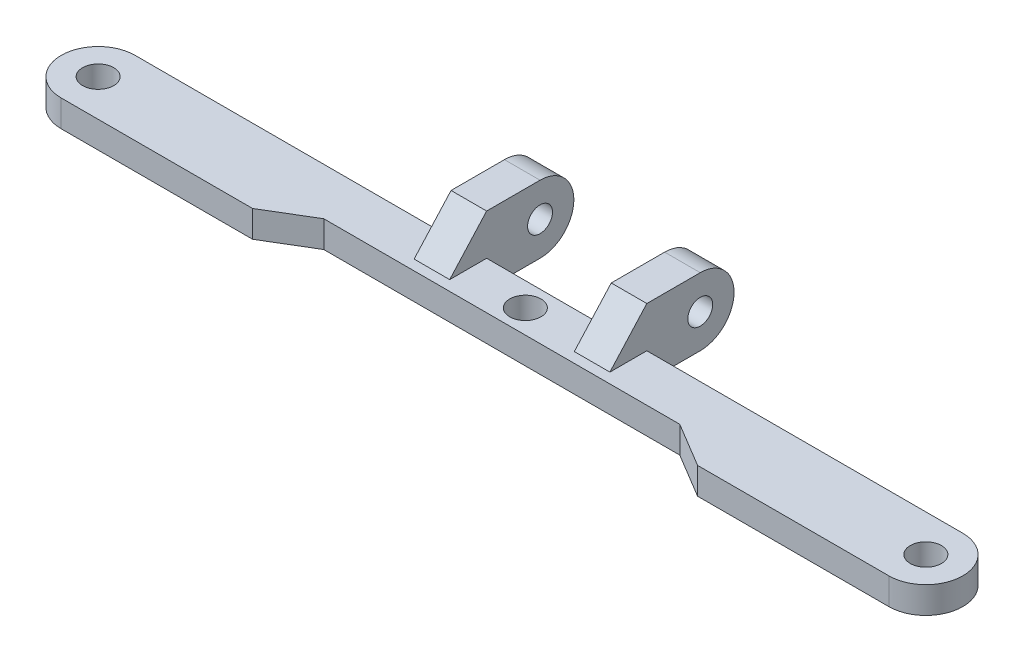
ISO-10303-21;
HEADER;
FILE_DESCRIPTION(('STEP AP214'),'2;1');
FILE_NAME('part.step','',(''),(''),'','','');
FILE_SCHEMA(('AUTOMOTIVE_DESIGN { 1 0 10303 214 1 1 1 1 }'));
ENDSEC;
DATA;
#1=APPLICATION_CONTEXT('core data for automotive mechanical design processes');
#2=APPLICATION_PROTOCOL_DEFINITION('international standard','automotive_design',2000,#1);
#3=PRODUCT_CONTEXT('',#1,'mechanical');
#4=PRODUCT('Part','Part','',(#3));
#5=PRODUCT_RELATED_PRODUCT_CATEGORY('part','',(#4));
#6=PRODUCT_DEFINITION_FORMATION('','',#4);
#7=PRODUCT_DEFINITION_CONTEXT('part definition',#1,'design');
#8=PRODUCT_DEFINITION('design','',#6,#7);
#9=PRODUCT_DEFINITION_SHAPE('','',#8);
#10=(LENGTH_UNIT() NAMED_UNIT(*) SI_UNIT(.MILLI.,.METRE.));
#11=(NAMED_UNIT(*) PLANE_ANGLE_UNIT() SI_UNIT($,.RADIAN.));
#12=(NAMED_UNIT(*) SI_UNIT($,.STERADIAN.) SOLID_ANGLE_UNIT());
#13=UNCERTAINTY_MEASURE_WITH_UNIT(LENGTH_MEASURE(1.E-05),#10,'distance_accuracy_value','');
#14=(GEOMETRIC_REPRESENTATION_CONTEXT(3) GLOBAL_UNCERTAINTY_ASSIGNED_CONTEXT((#13)) GLOBAL_UNIT_ASSIGNED_CONTEXT((#10,
#11,#12)) REPRESENTATION_CONTEXT('',''));
#15=CARTESIAN_POINT('',(0.,0.,0.));
#16=DIRECTION('',(0.,0.,1.));
#17=DIRECTION('',(1.,0.,0.));
#18=AXIS2_PLACEMENT_3D('',#15,#16,#17);
#19=CARTESIAN_POINT('',(-46.5,3.,4.14999999999999));
#20=DIRECTION('',(0.,0.,-1.));
#21=DIRECTION('',(-1.,0.,0.));
#22=AXIS2_PLACEMENT_3D('',#19,#20,#21);
#23=PLANE('',#22);
#24=DIRECTION('',(1.,0.,0.));
#25=VECTOR('',#24,1.);
#26=CARTESIAN_POINT('',(-46.5,0.,4.14999999999999));
#27=LINE('',#26,#25);
#28=CARTESIAN_POINT('',(-46.5,0.,4.14999999999999));
#29=VERTEX_POINT('',#28);
#30=CARTESIAN_POINT('',(-25.,0.,4.14999999999999));
#31=VERTEX_POINT('',#30);
#32=EDGE_CURVE('E322',#29,#31,#27,.T.);
#33=ORIENTED_EDGE('',*,*,#32,.T.);
#34=DIRECTION('',(0.,1.,0.));
#35=VECTOR('',#34,1.);
#36=CARTESIAN_POINT('',(-25.,0.,4.14999999999999));
#37=LINE('',#36,#35);
#38=CARTESIAN_POINT('',(-25.,3.,4.14999999999999));
#39=VERTEX_POINT('',#38);
#40=EDGE_CURVE('E206',#31,#39,#37,.T.);
#41=ORIENTED_EDGE('',*,*,#40,.T.);
#42=DIRECTION('',(1.,0.,0.));
#43=VECTOR('',#42,1.);
#44=CARTESIAN_POINT('',(-46.5,3.,4.14999999999999));
#45=LINE('',#44,#43);
#46=CARTESIAN_POINT('',(-46.5,3.,4.14999999999999));
#47=VERTEX_POINT('',#46);
#48=EDGE_CURVE('E330',#47,#39,#45,.T.);
#49=ORIENTED_EDGE('',*,*,#48,.F.);
#50=DIRECTION('',(0.,-1.,0.));
#51=VECTOR('',#50,1.);
#52=CARTESIAN_POINT('',(-46.5,3.,4.14999999999999));
#53=LINE('',#52,#51);
#54=EDGE_CURVE('E347',#47,#29,#53,.T.);
#55=ORIENTED_EDGE('',*,*,#54,.T.);
#56=EDGE_LOOP('',(#33,#41,#49,#55));
#57=FACE_BOUND('',#56,.T.);
#58=ADVANCED_FACE('F35',(#57),#23,.F.);
#59=CARTESIAN_POINT('',(46.5,3.,0.));
#60=DIRECTION('',(0.,1.,0.));
#61=DIRECTION('',(0.,0.,1.));
#62=AXIS2_PLACEMENT_3D('',#59,#60,#61);
#63=PLANE('',#62);
#64=CARTESIAN_POINT('',(0.,3.,-1.5));
#65=DIRECTION('',(0.,1.,0.));
#66=DIRECTION('',(0.,0.,1.));
#67=AXIS2_PLACEMENT_3D('',#64,#65,#66);
#68=CIRCLE('',#67,1.75);
#69=CARTESIAN_POINT('',(0.,3.,0.250000000000001));
#70=VERTEX_POINT('',#69);
#71=EDGE_CURVE('E199',#70,#70,#68,.T.);
#72=ORIENTED_EDGE('',*,*,#71,.F.);
#73=EDGE_LOOP('',(#72));
#74=FACE_BOUND('',#73,.T.);
#75=DIRECTION('',(-0.857492925712544,0.,0.514495755427526));
#76=VECTOR('',#75,1.);
#77=CARTESIAN_POINT('',(-25.,3.,4.14999999999999));
#78=LINE('',#77,#76);
#79=CARTESIAN_POINT('',(-20.,3.,1.14999999999999));
#80=VERTEX_POINT('',#79);
#81=EDGE_CURVE('E194',#80,#39,#78,.T.);
#82=ORIENTED_EDGE('',*,*,#81,.F.);
#83=DIRECTION('',(-1.,0.,0.));
#84=VECTOR('',#83,1.);
#85=CARTESIAN_POINT('',(-20.,3.,1.14999999999999));
#86=LINE('',#85,#84);
#87=CARTESIAN_POINT('',(20.,3.,1.14999999999999));
#88=VERTEX_POINT('',#87);
#89=EDGE_CURVE('E196',#88,#80,#86,.T.);
#90=ORIENTED_EDGE('',*,*,#89,.F.);
#91=DIRECTION('',(-0.857492925712545,0.,-0.514495755427526));
#92=VECTOR('',#91,1.);
#93=CARTESIAN_POINT('',(20.,3.,1.14999999999999));
#94=LINE('',#93,#92);
#95=CARTESIAN_POINT('',(25.,3.,4.14999999999998));
#96=VERTEX_POINT('',#95);
#97=EDGE_CURVE('E174',#96,#88,#94,.T.);
#98=ORIENTED_EDGE('',*,*,#97,.F.);
#99=CARTESIAN_POINT('',(46.5,3.,4.14999999999998));
#100=VERTEX_POINT('',#99);
#101=EDGE_CURVE('E329',#96,#100,#45,.T.);
#102=ORIENTED_EDGE('',*,*,#101,.T.);
#103=CARTESIAN_POINT('',(46.5,3.,0.));
#104=DIRECTION('',(0.,1.,0.));
#105=DIRECTION('',(0.,0.,1.));
#106=AXIS2_PLACEMENT_3D('',#103,#104,#105);
#107=CIRCLE('',#106,4.14999999999999);
#108=CARTESIAN_POINT('',(46.5,3.,-4.15));
#109=VERTEX_POINT('',#108);
#110=EDGE_CURVE('E318',#100,#109,#107,.T.);
#111=ORIENTED_EDGE('',*,*,#110,.T.);
#112=DIRECTION('',(-1.,0.,0.));
#113=VECTOR('',#112,1.);
#114=CARTESIAN_POINT('',(-46.5,3.,-4.14999999999999));
#115=LINE('',#114,#113);
#116=CARTESIAN_POINT('',(11.,3.,-4.15));
#117=VERTEX_POINT('',#116);
#118=EDGE_CURVE('E323',#109,#117,#115,.T.);
#119=ORIENTED_EDGE('',*,*,#118,.T.);
#120=DIRECTION('',(0.,0.,-1.));
#121=VECTOR('',#120,1.);
#122=CARTESIAN_POINT('',(11.,3.,0.));
#123=LINE('',#122,#121);
#124=CARTESIAN_POINT('',(11.,3.,0.));
#125=VERTEX_POINT('',#124);
#126=EDGE_CURVE('E292',#125,#117,#123,.T.);
#127=ORIENTED_EDGE('',*,*,#126,.F.);
#128=DIRECTION('',(1.,0.,0.));
#129=VECTOR('',#128,1.);
#130=CARTESIAN_POINT('',(7.,3.,0.));
#131=LINE('',#130,#129);
#132=CARTESIAN_POINT('',(7.,3.,0.));
#133=VERTEX_POINT('',#132);
#134=EDGE_CURVE('E301',#133,#125,#131,.T.);
#135=ORIENTED_EDGE('',*,*,#134,.F.);
#136=DIRECTION('',(0.,0.,-1.));
#137=VECTOR('',#136,1.);
#138=CARTESIAN_POINT('',(7.,3.,0.));
#139=LINE('',#138,#137);
#140=CARTESIAN_POINT('',(7.,3.,-4.15));
#141=VERTEX_POINT('',#140);
#142=EDGE_CURVE('E274',#133,#141,#139,.T.);
#143=ORIENTED_EDGE('',*,*,#142,.T.);
#144=CARTESIAN_POINT('',(-7.00000000000001,3.,-4.14999999999999));
#145=VERTEX_POINT('',#144);
#146=EDGE_CURVE('E327',#141,#145,#115,.T.);
#147=ORIENTED_EDGE('',*,*,#146,.T.);
#148=DIRECTION('',(0.,0.,-1.));
#149=VECTOR('',#148,1.);
#150=CARTESIAN_POINT('',(-7.,3.,0.));
#151=LINE('',#150,#149);
#152=CARTESIAN_POINT('',(-7.,3.,0.));
#153=VERTEX_POINT('',#152);
#154=EDGE_CURVE('E227',#153,#145,#151,.T.);
#155=ORIENTED_EDGE('',*,*,#154,.F.);
#156=DIRECTION('',(-1.,0.,0.));
#157=VECTOR('',#156,1.);
#158=CARTESIAN_POINT('',(-7.,3.,0.));
#159=LINE('',#158,#157);
#160=CARTESIAN_POINT('',(-11.,3.,0.));
#161=VERTEX_POINT('',#160);
#162=EDGE_CURVE('E58',#153,#161,#159,.T.);
#163=ORIENTED_EDGE('',*,*,#162,.T.);
#164=DIRECTION('',(0.,0.,-1.));
#165=VECTOR('',#164,1.);
#166=CARTESIAN_POINT('',(-11.,3.,0.));
#167=LINE('',#166,#165);
#168=CARTESIAN_POINT('',(-11.,3.,-4.14999999999999));
#169=VERTEX_POINT('',#168);
#170=EDGE_CURVE('E243',#161,#169,#167,.T.);
#171=ORIENTED_EDGE('',*,*,#170,.T.);
#172=CARTESIAN_POINT('',(-46.5,3.,-4.14999999999999));
#173=VERTEX_POINT('',#172);
#174=EDGE_CURVE('E321',#169,#173,#115,.T.);
#175=ORIENTED_EDGE('',*,*,#174,.T.);
#176=CARTESIAN_POINT('',(-46.5,3.,0.));
#177=DIRECTION('',(0.,1.,0.));
#178=DIRECTION('',(0.,0.,1.));
#179=AXIS2_PLACEMENT_3D('',#176,#177,#178);
#180=CIRCLE('',#179,4.14999999999999);
#181=EDGE_CURVE('E326',#173,#47,#180,.T.);
#182=ORIENTED_EDGE('',*,*,#181,.T.);
#183=ORIENTED_EDGE('',*,*,#48,.T.);
#184=EDGE_LOOP('',(#82,#90,#98,#102,#111,#119,#127,#135,#143,#147,#155,#163,#171,#175,#182,#183));
#185=FACE_BOUND('',#184,.T.);
#186=CARTESIAN_POINT('',(-46.5,3.,0.));
#187=DIRECTION('',(0.,1.,0.));
#188=DIRECTION('',(0.,0.,1.));
#189=AXIS2_PLACEMENT_3D('',#186,#187,#188);
#190=CIRCLE('',#189,1.75);
#191=CARTESIAN_POINT('',(-46.5,3.,1.75));
#192=VERTEX_POINT('',#191);
#193=EDGE_CURVE('E312',#192,#192,#190,.T.);
#194=ORIENTED_EDGE('',*,*,#193,.F.);
#195=EDGE_LOOP('',(#194));
#196=FACE_BOUND('',#195,.T.);
#197=CARTESIAN_POINT('',(46.5,3.,0.));
#198=DIRECTION('',(0.,1.,0.));
#199=DIRECTION('',(0.,0.,1.));
#200=AXIS2_PLACEMENT_3D('',#197,#198,#199);
#201=CIRCLE('',#200,1.75);
#202=CARTESIAN_POINT('',(46.5,3.,1.74999999999999));
#203=VERTEX_POINT('',#202);
#204=EDGE_CURVE('E306',#203,#203,#201,.T.);
#205=ORIENTED_EDGE('',*,*,#204,.F.);
#206=EDGE_LOOP('',(#205));
#207=FACE_BOUND('',#206,.T.);
#208=ADVANCED_FACE('F362',(#74,#185,#196,#207),#63,.T.);
#209=CARTESIAN_POINT('',(-46.5,3.,-4.14999999999999));
#210=DIRECTION('',(0.,0.,1.));
#211=DIRECTION('',(1.,0.,0.));
#212=AXIS2_PLACEMENT_3D('',#209,#210,#211);
#213=PLANE('',#212);
#214=DIRECTION('',(0.,-1.,0.));
#215=VECTOR('',#214,1.);
#216=CARTESIAN_POINT('',(-7.,3.,-4.15));
#217=LINE('',#216,#215);
#218=CARTESIAN_POINT('',(-7.00000000000001,0.,-4.14999999999999));
#219=VERTEX_POINT('',#218);
#220=EDGE_CURVE('E224',#145,#219,#217,.T.);
#221=ORIENTED_EDGE('',*,*,#220,.F.);
#222=ORIENTED_EDGE('',*,*,#146,.F.);
#223=DIRECTION('',(0.,-1.,0.));
#224=VECTOR('',#223,1.);
#225=CARTESIAN_POINT('',(7.,3.,-4.15));
#226=LINE('',#225,#224);
#227=CARTESIAN_POINT('',(7.,0.,-4.15));
#228=VERTEX_POINT('',#227);
#229=EDGE_CURVE('E277',#141,#228,#226,.T.);
#230=ORIENTED_EDGE('',*,*,#229,.T.);
#231=DIRECTION('',(-1.,0.,0.));
#232=VECTOR('',#231,1.);
#233=CARTESIAN_POINT('',(-46.5,0.,-4.14999999999999));
#234=LINE('',#233,#232);
#235=EDGE_CURVE('E341',#228,#219,#234,.T.);
#236=ORIENTED_EDGE('',*,*,#235,.T.);
#237=EDGE_LOOP('',(#221,#222,#230,#236));
#238=FACE_BOUND('',#237,.T.);
#239=ADVANCED_FACE('F386',(#238),#213,.F.);
#240=ORIENTED_EDGE('',*,*,#174,.F.);
#241=DIRECTION('',(0.,-1.,0.));
#242=VECTOR('',#241,1.);
#243=CARTESIAN_POINT('',(-11.,3.,-4.15));
#244=LINE('',#243,#242);
#245=CARTESIAN_POINT('',(-11.,0.,-4.15));
#246=VERTEX_POINT('',#245);
#247=EDGE_CURVE('E240',#169,#246,#244,.T.);
#248=ORIENTED_EDGE('',*,*,#247,.T.);
#249=CARTESIAN_POINT('',(-46.5,0.,-4.14999999999999));
#250=VERTEX_POINT('',#249);
#251=EDGE_CURVE('E336',#246,#250,#234,.T.);
#252=ORIENTED_EDGE('',*,*,#251,.T.);
#253=DIRECTION('',(0.,-1.,0.));
#254=VECTOR('',#253,1.);
#255=CARTESIAN_POINT('',(-46.5,3.,-4.14999999999999));
#256=LINE('',#255,#254);
#257=EDGE_CURVE('E43',#173,#250,#256,.T.);
#258=ORIENTED_EDGE('',*,*,#257,.F.);
#259=EDGE_LOOP('',(#240,#248,#252,#258));
#260=FACE_BOUND('',#259,.T.);
#261=ADVANCED_FACE('F384',(#260),#213,.F.);
#262=CARTESIAN_POINT('',(46.5,0.,0.));
#263=DIRECTION('',(0.,1.,0.));
#264=DIRECTION('',(0.,0.,1.));
#265=AXIS2_PLACEMENT_3D('',#262,#263,#264);
#266=PLANE('',#265);
#267=CARTESIAN_POINT('',(0.,0.,-1.5));
#268=DIRECTION('',(0.,1.,0.));
#269=DIRECTION('',(0.,0.,1.));
#270=AXIS2_PLACEMENT_3D('',#267,#268,#269);
#271=CIRCLE('',#270,1.75);
#272=CARTESIAN_POINT('',(0.,0.,0.250000000000001));
#273=VERTEX_POINT('',#272);
#274=EDGE_CURVE('E204',#273,#273,#271,.T.);
#275=ORIENTED_EDGE('',*,*,#274,.T.);
#276=EDGE_LOOP('',(#275));
#277=FACE_BOUND('',#276,.T.);
#278=DIRECTION('',(-1.,0.,0.));
#279=VECTOR('',#278,1.);
#280=CARTESIAN_POINT('',(-20.,0.,1.14999999999999));
#281=LINE('',#280,#279);
#282=CARTESIAN_POINT('',(20.,0.,1.14999999999999));
#283=VERTEX_POINT('',#282);
#284=CARTESIAN_POINT('',(-20.,0.,1.14999999999999));
#285=VERTEX_POINT('',#284);
#286=EDGE_CURVE('E182',#283,#285,#281,.T.);
#287=ORIENTED_EDGE('',*,*,#286,.T.);
#288=DIRECTION('',(-0.857492925712544,0.,0.514495755427526));
#289=VECTOR('',#288,1.);
#290=CARTESIAN_POINT('',(-25.,0.,4.14999999999999));
#291=LINE('',#290,#289);
#292=EDGE_CURVE('E187',#285,#31,#291,.T.);
#293=ORIENTED_EDGE('',*,*,#292,.T.);
#294=ORIENTED_EDGE('',*,*,#32,.F.);
#295=CARTESIAN_POINT('',(-46.5,0.,0.));
#296=DIRECTION('',(0.,1.,0.));
#297=DIRECTION('',(0.,0.,1.));
#298=AXIS2_PLACEMENT_3D('',#295,#296,#297);
#299=CIRCLE('',#298,4.14999999999999);
#300=EDGE_CURVE('E340',#250,#29,#299,.T.);
#301=ORIENTED_EDGE('',*,*,#300,.F.);
#302=ORIENTED_EDGE('',*,*,#251,.F.);
#303=DIRECTION('',(0.,0.,-1.));
#304=VECTOR('',#303,1.);
#305=CARTESIAN_POINT('',(-11.,0.,-4.15));
#306=LINE('',#305,#304);
#307=CARTESIAN_POINT('',(-11.,0.,-10.15));
#308=VERTEX_POINT('',#307);
#309=EDGE_CURVE('E238',#246,#308,#306,.T.);
#310=ORIENTED_EDGE('',*,*,#309,.T.);
#311=DIRECTION('',(-1.,0.,0.));
#312=VECTOR('',#311,1.);
#313=CARTESIAN_POINT('',(-7.,0.,-10.15));
#314=LINE('',#313,#312);
#315=CARTESIAN_POINT('',(-7.,0.,-10.15));
#316=VERTEX_POINT('',#315);
#317=EDGE_CURVE('E235',#316,#308,#314,.T.);
#318=ORIENTED_EDGE('',*,*,#317,.F.);
#319=DIRECTION('',(0.,0.,-1.));
#320=VECTOR('',#319,1.);
#321=CARTESIAN_POINT('',(-7.,0.,-4.15));
#322=LINE('',#321,#320);
#323=EDGE_CURVE('E221',#219,#316,#322,.T.);
#324=ORIENTED_EDGE('',*,*,#323,.F.);
#325=ORIENTED_EDGE('',*,*,#235,.F.);
#326=DIRECTION('',(0.,0.,-1.));
#327=VECTOR('',#326,1.);
#328=CARTESIAN_POINT('',(7.,0.,-4.15));
#329=LINE('',#328,#327);
#330=CARTESIAN_POINT('',(7.,0.,-10.15));
#331=VERTEX_POINT('',#330);
#332=EDGE_CURVE('E280',#228,#331,#329,.T.);
#333=ORIENTED_EDGE('',*,*,#332,.T.);
#334=DIRECTION('',(1.,0.,0.));
#335=VECTOR('',#334,1.);
#336=CARTESIAN_POINT('',(7.,0.,-10.15));
#337=LINE('',#336,#335);
#338=CARTESIAN_POINT('',(11.,0.,-10.15));
#339=VERTEX_POINT('',#338);
#340=EDGE_CURVE('E298',#331,#339,#337,.T.);
#341=ORIENTED_EDGE('',*,*,#340,.T.);
#342=DIRECTION('',(0.,0.,-1.));
#343=VECTOR('',#342,1.);
#344=CARTESIAN_POINT('',(11.,0.,-4.15));
#345=LINE('',#344,#343);
#346=CARTESIAN_POINT('',(11.,0.,-4.15));
#347=VERTEX_POINT('',#346);
#348=EDGE_CURVE('E268',#347,#339,#345,.T.);
#349=ORIENTED_EDGE('',*,*,#348,.F.);
#350=CARTESIAN_POINT('',(46.5,0.,-4.15));
#351=VERTEX_POINT('',#350);
#352=EDGE_CURVE('E337',#351,#347,#234,.T.);
#353=ORIENTED_EDGE('',*,*,#352,.F.);
#354=CARTESIAN_POINT('',(46.5,0.,0.));
#355=DIRECTION('',(0.,1.,0.));
#356=DIRECTION('',(0.,0.,1.));
#357=AXIS2_PLACEMENT_3D('',#354,#355,#356);
#358=CIRCLE('',#357,4.14999999999999);
#359=CARTESIAN_POINT('',(46.5,0.,4.14999999999998));
#360=VERTEX_POINT('',#359);
#361=EDGE_CURVE('E315',#360,#351,#358,.T.);
#362=ORIENTED_EDGE('',*,*,#361,.F.);
#363=CARTESIAN_POINT('',(25.,0.,4.14999999999998));
#364=VERTEX_POINT('',#363);
#365=EDGE_CURVE('E193',#364,#360,#27,.T.);
#366=ORIENTED_EDGE('',*,*,#365,.F.);
#367=DIRECTION('',(-0.857492925712545,0.,-0.514495755427526));
#368=VECTOR('',#367,1.);
#369=CARTESIAN_POINT('',(20.,0.,1.14999999999999));
#370=LINE('',#369,#368);
#371=EDGE_CURVE('E50',#364,#283,#370,.T.);
#372=ORIENTED_EDGE('',*,*,#371,.T.);
#373=EDGE_LOOP('',(#287,#293,#294,#301,#302,#310,#318,#324,#325,#333,#341,#349,#353,#362,#366,#372));
#374=FACE_BOUND('',#373,.T.);
#375=CARTESIAN_POINT('',(-46.5,0.,0.));
#376=DIRECTION('',(0.,1.,0.));
#377=DIRECTION('',(0.,0.,1.));
#378=AXIS2_PLACEMENT_3D('',#375,#376,#377);
#379=CIRCLE('',#378,1.75);
#380=CARTESIAN_POINT('',(-46.5,0.,1.75));
#381=VERTEX_POINT('',#380);
#382=EDGE_CURVE('E309',#381,#381,#379,.T.);
#383=ORIENTED_EDGE('',*,*,#382,.T.);
#384=EDGE_LOOP('',(#383));
#385=FACE_BOUND('',#384,.T.);
#386=CARTESIAN_POINT('',(46.5,0.,0.));
#387=DIRECTION('',(0.,1.,0.));
#388=DIRECTION('',(0.,0.,1.));
#389=AXIS2_PLACEMENT_3D('',#386,#387,#388);
#390=CIRCLE('',#389,1.75);
#391=CARTESIAN_POINT('',(46.5,0.,1.74999999999999));
#392=VERTEX_POINT('',#391);
#393=EDGE_CURVE('E300',#392,#392,#390,.T.);
#394=ORIENTED_EDGE('',*,*,#393,.T.);
#395=EDGE_LOOP('',(#394));
#396=FACE_BOUND('',#395,.T.);
#397=ADVANCED_FACE('F190',(#277,#374,#385,#396),#266,.F.);
#398=CARTESIAN_POINT('',(46.5,3.,0.));
#399=DIRECTION('',(0.,-1.,0.));
#400=DIRECTION('',(0.,0.,-1.));
#401=AXIS2_PLACEMENT_3D('',#398,#399,#400);
#402=CYLINDRICAL_SURFACE('',#401,4.14999999999999);
#403=ORIENTED_EDGE('',*,*,#361,.T.);
#404=DIRECTION('',(0.,-1.,0.));
#405=VECTOR('',#404,1.);
#406=CARTESIAN_POINT('',(46.5,3.,-4.15));
#407=LINE('',#406,#405);
#408=EDGE_CURVE('E11',#109,#351,#407,.T.);
#409=ORIENTED_EDGE('',*,*,#408,.F.);
#410=ORIENTED_EDGE('',*,*,#110,.F.);
#411=DIRECTION('',(0.,-1.,0.));
#412=VECTOR('',#411,1.);
#413=CARTESIAN_POINT('',(46.5,3.,4.14999999999998));
#414=LINE('',#413,#412);
#415=EDGE_CURVE('E333',#100,#360,#414,.T.);
#416=ORIENTED_EDGE('',*,*,#415,.T.);
#417=EDGE_LOOP('',(#403,#409,#410,#416));
#418=FACE_BOUND('',#417,.T.);
#419=ADVANCED_FACE('F37',(#418),#402,.T.);
#420=ORIENTED_EDGE('',*,*,#352,.T.);
#421=DIRECTION('',(0.,-1.,0.));
#422=VECTOR('',#421,1.);
#423=CARTESIAN_POINT('',(11.,3.,-4.15));
#424=LINE('',#423,#422);
#425=EDGE_CURVE('E294',#117,#347,#424,.T.);
#426=ORIENTED_EDGE('',*,*,#425,.F.);
#427=ORIENTED_EDGE('',*,*,#118,.F.);
#428=ORIENTED_EDGE('',*,*,#408,.T.);
#429=EDGE_LOOP('',(#420,#426,#427,#428));
#430=FACE_BOUND('',#429,.T.);
#431=ADVANCED_FACE('F424',(#430),#213,.F.);
#432=CARTESIAN_POINT('',(-46.5,3.,0.));
#433=DIRECTION('',(0.,-1.,0.));
#434=DIRECTION('',(0.,0.,-1.));
#435=AXIS2_PLACEMENT_3D('',#432,#433,#434);
#436=CYLINDRICAL_SURFACE('',#435,4.14999999999999);
#437=ORIENTED_EDGE('',*,*,#300,.T.);
#438=ORIENTED_EDGE('',*,*,#54,.F.);
#439=ORIENTED_EDGE('',*,*,#181,.F.);
#440=ORIENTED_EDGE('',*,*,#257,.T.);
#441=EDGE_LOOP('',(#437,#438,#439,#440));
#442=FACE_BOUND('',#441,.T.);
#443=ADVANCED_FACE('F354',(#442),#436,.T.);
#444=ORIENTED_EDGE('',*,*,#101,.F.);
#445=DIRECTION('',(0.,1.,0.));
#446=VECTOR('',#445,1.);
#447=CARTESIAN_POINT('',(25.,0.,4.14999999999998));
#448=LINE('',#447,#446);
#449=EDGE_CURVE('E179',#364,#96,#448,.T.);
#450=ORIENTED_EDGE('',*,*,#449,.F.);
#451=ORIENTED_EDGE('',*,*,#365,.T.);
#452=ORIENTED_EDGE('',*,*,#415,.F.);
#453=EDGE_LOOP('',(#444,#450,#451,#452));
#454=FACE_BOUND('',#453,.T.);
#455=ADVANCED_FACE('F406',(#454),#23,.F.);
#456=CARTESIAN_POINT('',(-46.5,3.,0.));
#457=DIRECTION('',(0.,-1.,0.));
#458=DIRECTION('',(0.,0.,-1.));
#459=AXIS2_PLACEMENT_3D('',#456,#457,#458);
#460=CYLINDRICAL_SURFACE('',#459,1.75);
#461=ORIENTED_EDGE('',*,*,#193,.T.);
#462=EDGE_LOOP('',(#461));
#463=FACE_BOUND('',#462,.T.);
#464=ORIENTED_EDGE('',*,*,#382,.F.);
#465=EDGE_LOOP('',(#464));
#466=FACE_BOUND('',#465,.T.);
#467=ADVANCED_FACE('F415',(#463,#466),#460,.F.);
#468=CARTESIAN_POINT('',(46.5,3.,0.));
#469=DIRECTION('',(0.,-1.,0.));
#470=DIRECTION('',(0.,0.,-1.));
#471=AXIS2_PLACEMENT_3D('',#468,#469,#470);
#472=CYLINDRICAL_SURFACE('',#471,1.75);
#473=ORIENTED_EDGE('',*,*,#204,.T.);
#474=EDGE_LOOP('',(#473));
#475=FACE_BOUND('',#474,.T.);
#476=ORIENTED_EDGE('',*,*,#393,.F.);
#477=EDGE_LOOP('',(#476));
#478=FACE_BOUND('',#477,.T.);
#479=ADVANCED_FACE('F421',(#475,#478),#472,.F.);
#480=CARTESIAN_POINT('',(7.,3.8,-10.15));
#481=DIRECTION('',(1.,0.,0.));
#482=DIRECTION('',(0.,0.,-1.));
#483=AXIS2_PLACEMENT_3D('',#480,#481,#482);
#484=CYLINDRICAL_SURFACE('',#483,3.8);
#485=CARTESIAN_POINT('',(11.,3.8,-10.15));
#486=DIRECTION('',(1.,0.,0.));
#487=DIRECTION('',(0.,0.,-1.));
#488=AXIS2_PLACEMENT_3D('',#485,#486,#487);
#489=CIRCLE('',#488,3.8);
#490=CARTESIAN_POINT('',(11.,7.6,-10.15));
#491=VERTEX_POINT('',#490);
#492=EDGE_CURVE('E261',#339,#491,#489,.T.);
#493=ORIENTED_EDGE('',*,*,#492,.F.);
#494=ORIENTED_EDGE('',*,*,#340,.F.);
#495=CARTESIAN_POINT('',(7.,3.8,-10.15));
#496=DIRECTION('',(1.,0.,0.));
#497=DIRECTION('',(0.,0.,-1.));
#498=AXIS2_PLACEMENT_3D('',#495,#496,#497);
#499=CIRCLE('',#498,3.8);
#500=CARTESIAN_POINT('',(7.,7.6,-10.15));
#501=VERTEX_POINT('',#500);
#502=EDGE_CURVE('E264',#331,#501,#499,.T.);
#503=ORIENTED_EDGE('',*,*,#502,.T.);
#504=DIRECTION('',(1.,0.,0.));
#505=VECTOR('',#504,1.);
#506=CARTESIAN_POINT('',(7.,7.6,-10.15));
#507=LINE('',#506,#505);
#508=EDGE_CURVE('E283',#501,#491,#507,.T.);
#509=ORIENTED_EDGE('',*,*,#508,.T.);
#510=EDGE_LOOP('',(#493,#494,#503,#509));
#511=FACE_BOUND('',#510,.T.);
#512=ADVANCED_FACE('F439',(#511),#484,.T.);
#513=CARTESIAN_POINT('',(7.,7.6,-4.15));
#514=DIRECTION('',(0.,0.669856024139718,0.742491014709087));
#515=DIRECTION('',(0.,-0.742491014709087,0.669856024139718));
#516=AXIS2_PLACEMENT_3D('',#513,#514,#515);
#517=PLANE('',#516);
#518=DIRECTION('',(0.,-0.742491014709087,0.669856024139718));
#519=VECTOR('',#518,1.);
#520=CARTESIAN_POINT('',(11.,7.6,-4.15));
#521=LINE('',#520,#519);
#522=CARTESIAN_POINT('',(11.,7.6,-4.15));
#523=VERTEX_POINT('',#522);
#524=EDGE_CURVE('E289',#523,#125,#521,.T.);
#525=ORIENTED_EDGE('',*,*,#524,.F.);
#526=DIRECTION('',(1.,0.,0.));
#527=VECTOR('',#526,1.);
#528=CARTESIAN_POINT('',(7.,7.6,-4.15));
#529=LINE('',#528,#527);
#530=CARTESIAN_POINT('',(7.,7.6,-4.15));
#531=VERTEX_POINT('',#530);
#532=EDGE_CURVE('E303',#531,#523,#529,.T.);
#533=ORIENTED_EDGE('',*,*,#532,.F.);
#534=DIRECTION('',(0.,-0.742491014709087,0.669856024139718));
#535=VECTOR('',#534,1.);
#536=CARTESIAN_POINT('',(7.,7.6,-4.15));
#537=LINE('',#536,#535);
#538=EDGE_CURVE('E271',#531,#133,#537,.T.);
#539=ORIENTED_EDGE('',*,*,#538,.T.);
#540=ORIENTED_EDGE('',*,*,#134,.T.);
#541=EDGE_LOOP('',(#525,#533,#539,#540));
#542=FACE_BOUND('',#541,.T.);
#543=ADVANCED_FACE('F447',(#542),#517,.T.);
#544=CARTESIAN_POINT('',(7.,7.6,-10.15));
#545=DIRECTION('',(0.,1.,0.));
#546=DIRECTION('',(0.,0.,1.));
#547=AXIS2_PLACEMENT_3D('',#544,#545,#546);
#548=PLANE('',#547);
#549=DIRECTION('',(0.,0.,1.));
#550=VECTOR('',#549,1.);
#551=CARTESIAN_POINT('',(11.,7.6,-10.15));
#552=LINE('',#551,#550);
#553=EDGE_CURVE('E286',#491,#523,#552,.T.);
#554=ORIENTED_EDGE('',*,*,#553,.F.);
#555=ORIENTED_EDGE('',*,*,#508,.F.);
#556=DIRECTION('',(0.,0.,1.));
#557=VECTOR('',#556,1.);
#558=CARTESIAN_POINT('',(7.,7.6,-10.15));
#559=LINE('',#558,#557);
#560=EDGE_CURVE('E267',#501,#531,#559,.T.);
#561=ORIENTED_EDGE('',*,*,#560,.T.);
#562=ORIENTED_EDGE('',*,*,#532,.T.);
#563=EDGE_LOOP('',(#554,#555,#561,#562));
#564=FACE_BOUND('',#563,.T.);
#565=ADVANCED_FACE('F443',(#564),#548,.T.);
#566=CARTESIAN_POINT('',(7.,3.8,-10.15));
#567=DIRECTION('',(1.,0.,0.));
#568=DIRECTION('',(0.,0.,-1.));
#569=AXIS2_PLACEMENT_3D('',#566,#567,#568);
#570=PLANE('',#569);
#571=CARTESIAN_POINT('',(7.,3.8,-10.15));
#572=DIRECTION('',(1.,0.,0.));
#573=DIRECTION('',(0.,0.,-1.));
#574=AXIS2_PLACEMENT_3D('',#571,#572,#573);
#575=CIRCLE('',#574,1.4);
#576=CARTESIAN_POINT('',(7.,3.8,-11.55));
#577=VERTEX_POINT('',#576);
#578=EDGE_CURVE('E258',#577,#577,#575,.T.);
#579=ORIENTED_EDGE('',*,*,#578,.T.);
#580=EDGE_LOOP('',(#579));
#581=FACE_BOUND('',#580,.T.);
#582=ORIENTED_EDGE('',*,*,#502,.F.);
#583=ORIENTED_EDGE('',*,*,#332,.F.);
#584=ORIENTED_EDGE('',*,*,#229,.F.);
#585=ORIENTED_EDGE('',*,*,#142,.F.);
#586=ORIENTED_EDGE('',*,*,#538,.F.);
#587=ORIENTED_EDGE('',*,*,#560,.F.);
#588=EDGE_LOOP('',(#582,#583,#584,#585,#586,#587));
#589=FACE_BOUND('',#588,.T.);
#590=ADVANCED_FACE('F449',(#581,#589),#570,.F.);
#591=CARTESIAN_POINT('',(11.,3.8,-10.15));
#592=DIRECTION('',(1.,0.,0.));
#593=DIRECTION('',(0.,0.,-1.));
#594=AXIS2_PLACEMENT_3D('',#591,#592,#593);
#595=PLANE('',#594);
#596=CARTESIAN_POINT('',(11.,3.8,-10.15));
#597=DIRECTION('',(1.,0.,0.));
#598=DIRECTION('',(0.,0.,-1.));
#599=AXIS2_PLACEMENT_3D('',#596,#597,#598);
#600=CIRCLE('',#599,1.4);
#601=CARTESIAN_POINT('',(11.,3.8,-11.55));
#602=VERTEX_POINT('',#601);
#603=EDGE_CURVE('E251',#602,#602,#600,.T.);
#604=ORIENTED_EDGE('',*,*,#603,.F.);
#605=EDGE_LOOP('',(#604));
#606=FACE_BOUND('',#605,.T.);
#607=ORIENTED_EDGE('',*,*,#492,.T.);
#608=ORIENTED_EDGE('',*,*,#553,.T.);
#609=ORIENTED_EDGE('',*,*,#524,.T.);
#610=ORIENTED_EDGE('',*,*,#126,.T.);
#611=ORIENTED_EDGE('',*,*,#425,.T.);
#612=ORIENTED_EDGE('',*,*,#348,.T.);
#613=EDGE_LOOP('',(#607,#608,#609,#610,#611,#612));
#614=FACE_BOUND('',#613,.T.);
#615=ADVANCED_FACE('F435',(#606,#614),#595,.T.);
#616=CARTESIAN_POINT('',(7.,3.8,-10.15));
#617=DIRECTION('',(1.,0.,0.));
#618=DIRECTION('',(0.,0.,-1.));
#619=AXIS2_PLACEMENT_3D('',#616,#617,#618);
#620=CYLINDRICAL_SURFACE('',#619,1.4);
#621=ORIENTED_EDGE('',*,*,#578,.F.);
#622=EDGE_LOOP('',(#621));
#623=FACE_BOUND('',#622,.T.);
#624=ORIENTED_EDGE('',*,*,#603,.T.);
#625=EDGE_LOOP('',(#624));
#626=FACE_BOUND('',#625,.T.);
#627=ADVANCED_FACE('F457',(#623,#626),#620,.F.);
#628=CARTESIAN_POINT('',(-7.,3.8,-10.15));
#629=DIRECTION('',(-1.,0.,0.));
#630=DIRECTION('',(0.,0.,-1.));
#631=AXIS2_PLACEMENT_3D('',#628,#629,#630);
#632=PLANE('',#631);
#633=CARTESIAN_POINT('',(-7.,3.8,-10.15));
#634=DIRECTION('',(1.,0.,0.));
#635=DIRECTION('',(0.,0.,-1.));
#636=AXIS2_PLACEMENT_3D('',#633,#634,#635);
#637=CIRCLE('',#636,3.8);
#638=CARTESIAN_POINT('',(-7.,7.6,-10.15));
#639=VERTEX_POINT('',#638);
#640=EDGE_CURVE('E218',#316,#639,#637,.T.);
#641=ORIENTED_EDGE('',*,*,#640,.T.);
#642=DIRECTION('',(0.,0.,1.));
#643=VECTOR('',#642,1.);
#644=CARTESIAN_POINT('',(-7.,7.6,-10.15));
#645=LINE('',#644,#643);
#646=CARTESIAN_POINT('',(-7.,7.6,-4.15));
#647=VERTEX_POINT('',#646);
#648=EDGE_CURVE('E233',#639,#647,#645,.T.);
#649=ORIENTED_EDGE('',*,*,#648,.T.);
#650=DIRECTION('',(0.,-0.742491014709087,0.669856024139718));
#651=VECTOR('',#650,1.);
#652=CARTESIAN_POINT('',(-7.,7.6,-4.15));
#653=LINE('',#652,#651);
#654=EDGE_CURVE('E230',#647,#153,#653,.T.);
#655=ORIENTED_EDGE('',*,*,#654,.T.);
#656=ORIENTED_EDGE('',*,*,#154,.T.);
#657=ORIENTED_EDGE('',*,*,#220,.T.);
#658=ORIENTED_EDGE('',*,*,#323,.T.);
#659=EDGE_LOOP('',(#641,#649,#655,#656,#657,#658));
#660=FACE_BOUND('',#659,.T.);
#661=CARTESIAN_POINT('',(-7.,3.8,-10.15));
#662=DIRECTION('',(1.,0.,0.));
#663=DIRECTION('',(0.,0.,-1.));
#664=AXIS2_PLACEMENT_3D('',#661,#662,#663);
#665=CIRCLE('',#664,1.4);
#666=CARTESIAN_POINT('',(-7.,3.8,-11.55));
#667=VERTEX_POINT('',#666);
#668=EDGE_CURVE('E212',#667,#667,#665,.T.);
#669=ORIENTED_EDGE('',*,*,#668,.F.);
#670=EDGE_LOOP('',(#669));
#671=FACE_BOUND('',#670,.T.);
#672=ADVANCED_FACE('F371',(#660,#671),#632,.F.);
#673=CARTESIAN_POINT('',(-11.,3.8,-10.15));
#674=DIRECTION('',(-1.,0.,0.));
#675=DIRECTION('',(0.,0.,-1.));
#676=AXIS2_PLACEMENT_3D('',#673,#674,#675);
#677=PLANE('',#676);
#678=CARTESIAN_POINT('',(-11.,3.8,-10.15));
#679=DIRECTION('',(1.,0.,0.));
#680=DIRECTION('',(0.,0.,-1.));
#681=AXIS2_PLACEMENT_3D('',#678,#679,#680);
#682=CIRCLE('',#681,3.8);
#683=CARTESIAN_POINT('',(-11.,7.6,-10.15));
#684=VERTEX_POINT('',#683);
#685=EDGE_CURVE('E215',#308,#684,#682,.T.);
#686=ORIENTED_EDGE('',*,*,#685,.F.);
#687=ORIENTED_EDGE('',*,*,#309,.F.);
#688=ORIENTED_EDGE('',*,*,#247,.F.);
#689=ORIENTED_EDGE('',*,*,#170,.F.);
#690=DIRECTION('',(0.,-0.742491014709087,0.669856024139718));
#691=VECTOR('',#690,1.);
#692=CARTESIAN_POINT('',(-11.,7.6,-4.15));
#693=LINE('',#692,#691);
#694=CARTESIAN_POINT('',(-11.,7.6,-4.15));
#695=VERTEX_POINT('',#694);
#696=EDGE_CURVE('E245',#695,#161,#693,.T.);
#697=ORIENTED_EDGE('',*,*,#696,.F.);
#698=DIRECTION('',(0.,0.,1.));
#699=VECTOR('',#698,1.);
#700=CARTESIAN_POINT('',(-11.,7.6,-10.15));
#701=LINE('',#700,#699);
#702=EDGE_CURVE('E222',#684,#695,#701,.T.);
#703=ORIENTED_EDGE('',*,*,#702,.F.);
#704=EDGE_LOOP('',(#686,#687,#688,#689,#697,#703));
#705=FACE_BOUND('',#704,.T.);
#706=CARTESIAN_POINT('',(-11.,3.8,-10.15));
#707=DIRECTION('',(1.,0.,0.));
#708=DIRECTION('',(0.,0.,-1.));
#709=AXIS2_PLACEMENT_3D('',#706,#707,#708);
#710=CIRCLE('',#709,1.4);
#711=CARTESIAN_POINT('',(-11.,3.8,-11.55));
#712=VERTEX_POINT('',#711);
#713=EDGE_CURVE('E209',#712,#712,#710,.T.);
#714=ORIENTED_EDGE('',*,*,#713,.T.);
#715=EDGE_LOOP('',(#714));
#716=FACE_BOUND('',#715,.T.);
#717=ADVANCED_FACE('F381',(#705,#716),#677,.T.);
#718=CARTESIAN_POINT('',(-7.,3.8,-10.15));
#719=DIRECTION('',(-1.,0.,0.));
#720=DIRECTION('',(0.,0.,1.));
#721=AXIS2_PLACEMENT_3D('',#718,#719,#720);
#722=CYLINDRICAL_SURFACE('',#721,3.8);
#723=ORIENTED_EDGE('',*,*,#685,.T.);
#724=DIRECTION('',(-1.,0.,0.));
#725=VECTOR('',#724,1.);
#726=CARTESIAN_POINT('',(-7.,7.6,-10.15));
#727=LINE('',#726,#725);
#728=EDGE_CURVE('E248',#639,#684,#727,.T.);
#729=ORIENTED_EDGE('',*,*,#728,.F.);
#730=ORIENTED_EDGE('',*,*,#640,.F.);
#731=ORIENTED_EDGE('',*,*,#317,.T.);
#732=EDGE_LOOP('',(#723,#729,#730,#731));
#733=FACE_BOUND('',#732,.T.);
#734=ADVANCED_FACE('F391',(#733),#722,.T.);
#735=CARTESIAN_POINT('',(-7.,7.6,-10.15));
#736=DIRECTION('',(0.,-1.,0.));
#737=DIRECTION('',(0.,0.,-1.));
#738=AXIS2_PLACEMENT_3D('',#735,#736,#737);
#739=PLANE('',#738);
#740=ORIENTED_EDGE('',*,*,#702,.T.);
#741=DIRECTION('',(-1.,0.,0.));
#742=VECTOR('',#741,1.);
#743=CARTESIAN_POINT('',(-7.,7.6,-4.15));
#744=LINE('',#743,#742);
#745=EDGE_CURVE('E252',#647,#695,#744,.T.);
#746=ORIENTED_EDGE('',*,*,#745,.F.);
#747=ORIENTED_EDGE('',*,*,#648,.F.);
#748=ORIENTED_EDGE('',*,*,#728,.T.);
#749=EDGE_LOOP('',(#740,#746,#747,#748));
#750=FACE_BOUND('',#749,.T.);
#751=ADVANCED_FACE('F393',(#750),#739,.F.);
#752=CARTESIAN_POINT('',(-7.,7.6,-4.15));
#753=DIRECTION('',(0.,-0.669856024139718,-0.742491014709087));
#754=DIRECTION('',(0.,0.742491014709087,-0.669856024139718));
#755=AXIS2_PLACEMENT_3D('',#752,#753,#754);
#756=PLANE('',#755);
#757=ORIENTED_EDGE('',*,*,#696,.T.);
#758=ORIENTED_EDGE('',*,*,#162,.F.);
#759=ORIENTED_EDGE('',*,*,#654,.F.);
#760=ORIENTED_EDGE('',*,*,#745,.T.);
#761=EDGE_LOOP('',(#757,#758,#759,#760));
#762=FACE_BOUND('',#761,.T.);
#763=ADVANCED_FACE('F377',(#762),#756,.F.);
#764=CARTESIAN_POINT('',(-7.,3.8,-10.15));
#765=DIRECTION('',(-1.,0.,0.));
#766=DIRECTION('',(0.,0.,1.));
#767=AXIS2_PLACEMENT_3D('',#764,#765,#766);
#768=CYLINDRICAL_SURFACE('',#767,1.4);
#769=ORIENTED_EDGE('',*,*,#668,.T.);
#770=EDGE_LOOP('',(#769));
#771=FACE_BOUND('',#770,.T.);
#772=ORIENTED_EDGE('',*,*,#713,.F.);
#773=EDGE_LOOP('',(#772));
#774=FACE_BOUND('',#773,.T.);
#775=ADVANCED_FACE('F400',(#771,#774),#768,.F.);
#776=CARTESIAN_POINT('',(-25.,0.,4.14999999999999));
#777=DIRECTION('',(-0.514495755427526,0.,-0.857492925712545));
#778=DIRECTION('',(-0.857492925712545,0.,0.514495755427526));
#779=AXIS2_PLACEMENT_3D('',#776,#777,#778);
#780=PLANE('',#779);
#781=ORIENTED_EDGE('',*,*,#81,.T.);
#782=ORIENTED_EDGE('',*,*,#40,.F.);
#783=ORIENTED_EDGE('',*,*,#292,.F.);
#784=DIRECTION('',(0.,1.,0.));
#785=VECTOR('',#784,1.);
#786=CARTESIAN_POINT('',(-20.,0.,1.14999999999999));
#787=LINE('',#786,#785);
#788=EDGE_CURVE('E178',#285,#80,#787,.T.);
#789=ORIENTED_EDGE('',*,*,#788,.T.);
#790=EDGE_LOOP('',(#781,#782,#783,#789));
#791=FACE_BOUND('',#790,.T.);
#792=ADVANCED_FACE('F489',(#791),#780,.F.);
#793=CARTESIAN_POINT('',(-20.,0.,1.14999999999999));
#794=DIRECTION('',(0.,0.,-1.));
#795=DIRECTION('',(-1.,0.,0.));
#796=AXIS2_PLACEMENT_3D('',#793,#794,#795);
#797=PLANE('',#796);
#798=ORIENTED_EDGE('',*,*,#89,.T.);
#799=ORIENTED_EDGE('',*,*,#788,.F.);
#800=ORIENTED_EDGE('',*,*,#286,.F.);
#801=DIRECTION('',(0.,1.,0.));
#802=VECTOR('',#801,1.);
#803=CARTESIAN_POINT('',(20.,0.,1.14999999999999));
#804=LINE('',#803,#802);
#805=EDGE_CURVE('E170',#283,#88,#804,.T.);
#806=ORIENTED_EDGE('',*,*,#805,.T.);
#807=EDGE_LOOP('',(#798,#799,#800,#806));
#808=FACE_BOUND('',#807,.T.);
#809=ADVANCED_FACE('F183',(#808),#797,.F.);
#810=CARTESIAN_POINT('',(20.,0.,1.14999999999999));
#811=DIRECTION('',(0.514495755427526,0.,-0.857492925712545));
#812=DIRECTION('',(-0.857492925712545,0.,-0.514495755427526));
#813=AXIS2_PLACEMENT_3D('',#810,#811,#812);
#814=PLANE('',#813);
#815=ORIENTED_EDGE('',*,*,#97,.T.);
#816=ORIENTED_EDGE('',*,*,#805,.F.);
#817=ORIENTED_EDGE('',*,*,#371,.F.);
#818=ORIENTED_EDGE('',*,*,#449,.T.);
#819=EDGE_LOOP('',(#815,#816,#817,#818));
#820=FACE_BOUND('',#819,.T.);
#821=ADVANCED_FACE('F172',(#820),#814,.F.);
#822=CARTESIAN_POINT('',(0.,0.,-1.5));
#823=DIRECTION('',(0.,1.,0.));
#824=DIRECTION('',(0.,0.,1.));
#825=AXIS2_PLACEMENT_3D('',#822,#823,#824);
#826=CYLINDRICAL_SURFACE('',#825,1.75);
#827=ORIENTED_EDGE('',*,*,#274,.F.);
#828=EDGE_LOOP('',(#827));
#829=FACE_BOUND('',#828,.T.);
#830=ORIENTED_EDGE('',*,*,#71,.T.);
#831=EDGE_LOOP('',(#830));
#832=FACE_BOUND('',#831,.T.);
#833=ADVANCED_FACE('F481',(#829,#832),#826,.F.);
#834=CLOSED_SHELL('',(#58,#208,#239,#261,#397,#419,#431,#443,#455,#467,#479,#512,#543,#565,#590,
#615,#627,#672,#717,#734,#751,#763,#775,#792,#809,#821,#833));
#835=MANIFOLD_SOLID_BREP('B2',#834);
#836=ADVANCED_BREP_SHAPE_REPRESENTATION('',(#18,#835),#14);
#837=SHAPE_DEFINITION_REPRESENTATION(#9,#836);
ENDSEC;
END-ISO-10303-21;
